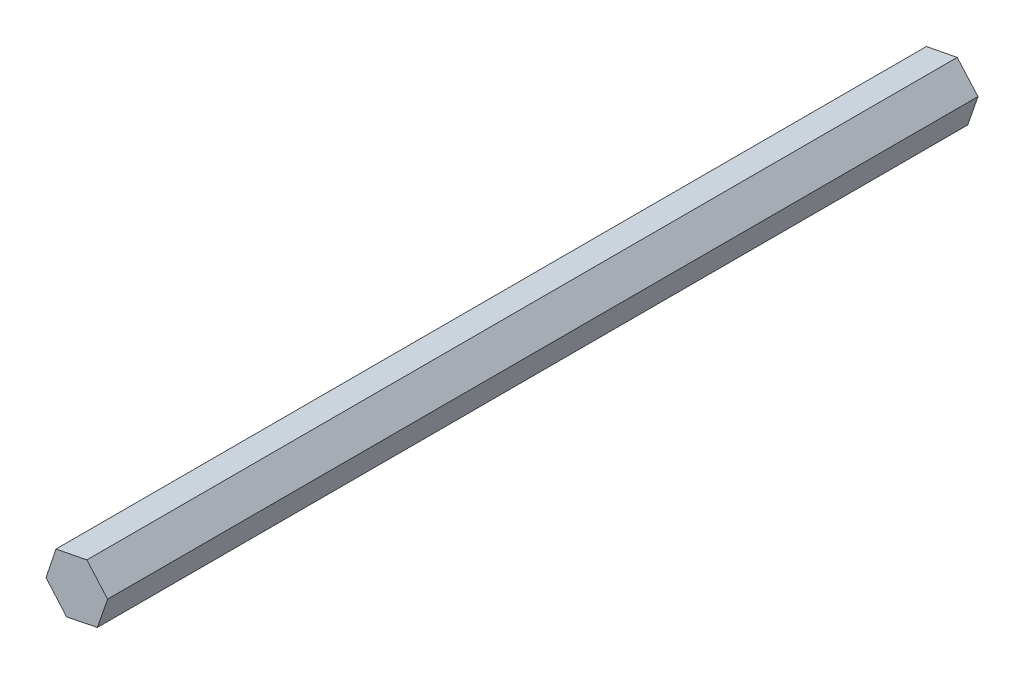
ISO-10303-21;
HEADER;
FILE_DESCRIPTION(('STEP AP214'),'2;1');
FILE_NAME('part.step','',(''),(''),'','','');
FILE_SCHEMA(('AUTOMOTIVE_DESIGN { 1 0 10303 214 1 1 1 1 }'));
ENDSEC;
DATA;
#1=APPLICATION_CONTEXT('core data for automotive mechanical design processes');
#2=APPLICATION_PROTOCOL_DEFINITION('international standard','automotive_design',2000,#1);
#3=PRODUCT_CONTEXT('',#1,'mechanical');
#4=PRODUCT('Part','Part','',(#3));
#5=PRODUCT_RELATED_PRODUCT_CATEGORY('part','',(#4));
#6=PRODUCT_DEFINITION_FORMATION('','',#4);
#7=PRODUCT_DEFINITION_CONTEXT('part definition',#1,'design');
#8=PRODUCT_DEFINITION('design','',#6,#7);
#9=PRODUCT_DEFINITION_SHAPE('','',#8);
#10=(LENGTH_UNIT() NAMED_UNIT(*) SI_UNIT(.MILLI.,.METRE.));
#11=(NAMED_UNIT(*) PLANE_ANGLE_UNIT() SI_UNIT($,.RADIAN.));
#12=(NAMED_UNIT(*) SI_UNIT($,.STERADIAN.) SOLID_ANGLE_UNIT());
#13=UNCERTAINTY_MEASURE_WITH_UNIT(LENGTH_MEASURE(1.E-05),#10,'distance_accuracy_value','');
#14=(GEOMETRIC_REPRESENTATION_CONTEXT(3) GLOBAL_UNCERTAINTY_ASSIGNED_CONTEXT((#13)) GLOBAL_UNIT_ASSIGNED_CONTEXT((#10,
#11,#12)) REPRESENTATION_CONTEXT('',''));
#15=CARTESIAN_POINT('',(0.,0.,0.));
#16=DIRECTION('',(0.,0.,1.));
#17=DIRECTION('',(1.,0.,0.));
#18=AXIS2_PLACEMENT_3D('',#15,#16,#17);
#19=CARTESIAN_POINT('',(-6.01957165055815,2.02169660033267,-25.4));
#20=DIRECTION('',(-0.947964039457976,0.318377417375223,0.));
#21=DIRECTION('',(-0.318377417375223,-0.947964039457976,0.));
#22=AXIS2_PLACEMENT_3D('',#19,#20,#21);
#23=PLANE('',#22);
#24=DIRECTION('',(0.318377417375223,0.947964039457976,0.));
#25=VECTOR('',#24,1.);
#26=CARTESIAN_POINT('',(-6.01957165055815,2.02169660033267,-228.6));
#27=LINE('',#26,#25);
#28=CARTESIAN_POINT('',(-7.17571857524597,-1.42071372502755,-228.6));
#29=VERTEX_POINT('',#28);
#30=CARTESIAN_POINT('',(-4.84121158124874,5.53024623443575,-228.6));
#31=VERTEX_POINT('',#30);
#32=EDGE_CURVE('E120',#29,#31,#27,.T.);
#33=ORIENTED_EDGE('',*,*,#32,.F.);
#34=DIRECTION('',(0.,0.,-1.));
#35=VECTOR('',#34,1.);
#36=CARTESIAN_POINT('',(-7.17571857524597,-1.42071372502755,-25.4));
#37=LINE('',#36,#35);
#38=CARTESIAN_POINT('',(-7.17571857524597,-1.42071372502755,-25.4));
#39=VERTEX_POINT('',#38);
#40=EDGE_CURVE('E11',#39,#29,#37,.T.);
#41=ORIENTED_EDGE('',*,*,#40,.F.);
#42=DIRECTION('',(0.318377417375223,0.947964039457976,0.));
#43=VECTOR('',#42,1.);
#44=CARTESIAN_POINT('',(-6.01957165055815,2.02169660033267,-25.4));
#45=LINE('',#44,#43);
#46=CARTESIAN_POINT('',(-4.84121158124874,5.53024623443575,-25.4));
#47=VERTEX_POINT('',#46);
#48=EDGE_CURVE('E134',#39,#47,#45,.T.);
#49=ORIENTED_EDGE('',*,*,#48,.T.);
#50=DIRECTION('',(0.,0.,-1.));
#51=VECTOR('',#50,1.);
#52=CARTESIAN_POINT('',(-4.84121158124874,5.53024623443575,-25.4));
#53=LINE('',#52,#51);
#54=EDGE_CURVE('E38',#47,#31,#53,.T.);
#55=ORIENTED_EDGE('',*,*,#54,.T.);
#56=EDGE_LOOP('',(#33,#41,#49,#55));
#57=FACE_BOUND('',#56,.T.);
#58=ADVANCED_FACE('F35',(#57),#23,.T.);
#59=CARTESIAN_POINT('',(-4.79509283412342,-4.16288177974564,-25.4));
#60=DIRECTION('',(-0.755132729783216,-0.655571933818211,0.));
#61=DIRECTION('',(0.655571933818211,-0.755132729783216,0.));
#62=AXIS2_PLACEMENT_3D('',#59,#60,#61);
#63=PLANE('',#62);
#64=DIRECTION('',(-0.655571933818211,0.755132729783216,0.));
#65=VECTOR('',#64,1.);
#66=CARTESIAN_POINT('',(-4.79509283412342,-4.16288177974564,-228.6));
#67=LINE('',#66,#65);
#68=CARTESIAN_POINT('',(-2.36872793758021,-6.95773533167472,-228.6));
#69=VERTEX_POINT('',#68);
#70=EDGE_CURVE('E132',#69,#29,#67,.T.);
#71=ORIENTED_EDGE('',*,*,#70,.F.);
#72=DIRECTION('',(0.,0.,-1.));
#73=VECTOR('',#72,1.);
#74=CARTESIAN_POINT('',(-2.36872793758021,-6.95773533167472,-25.4));
#75=LINE('',#74,#73);
#76=CARTESIAN_POINT('',(-2.36872793758021,-6.95773533167472,-25.4));
#77=VERTEX_POINT('',#76);
#78=EDGE_CURVE('E44',#77,#69,#75,.T.);
#79=ORIENTED_EDGE('',*,*,#78,.F.);
#80=DIRECTION('',(-0.655571933818211,0.755132729783216,0.));
#81=VECTOR('',#80,1.);
#82=CARTESIAN_POINT('',(-4.79509283412342,-4.16288177974564,-25.4));
#83=LINE('',#82,#81);
#84=EDGE_CURVE('E110',#77,#39,#83,.T.);
#85=ORIENTED_EDGE('',*,*,#84,.T.);
#86=ORIENTED_EDGE('',*,*,#40,.T.);
#87=EDGE_LOOP('',(#71,#79,#85,#86));
#88=FACE_BOUND('',#87,.T.);
#89=ADVANCED_FACE('F142',(#88),#63,.T.);
#90=CARTESIAN_POINT('',(1.25894521064635,-6.22395026945031,-25.4));
#91=DIRECTION('',(0.198259088290764,-0.980149648732333,0.));
#92=DIRECTION('',(0.980149648732333,0.198259088290764,0.));
#93=AXIS2_PLACEMENT_3D('',#90,#91,#92);
#94=PLANE('',#93);
#95=DIRECTION('',(-0.980149648732333,-0.198259088290764,0.));
#96=VECTOR('',#95,1.);
#97=CARTESIAN_POINT('',(1.25894521064635,-6.22395026945031,-228.6));
#98=LINE('',#97,#96);
#99=CARTESIAN_POINT('',(4.81823346500206,-5.50399771405711,-228.6));
#100=VERTEX_POINT('',#99);
#101=EDGE_CURVE('E97',#100,#69,#98,.T.);
#102=ORIENTED_EDGE('',*,*,#101,.F.);
#103=DIRECTION('',(0.,0.,-1.));
#104=VECTOR('',#103,1.);
#105=CARTESIAN_POINT('',(4.81823346500206,-5.50399771405711,-25.4));
#106=LINE('',#105,#104);
#107=CARTESIAN_POINT('',(4.81823346500206,-5.50399771405711,-25.4));
#108=VERTEX_POINT('',#107);
#109=EDGE_CURVE('E92',#108,#100,#106,.T.);
#110=ORIENTED_EDGE('',*,*,#109,.F.);
#111=DIRECTION('',(-0.980149648732333,-0.198259088290764,0.));
#112=VECTOR('',#111,1.);
#113=CARTESIAN_POINT('',(1.25894521064635,-6.22395026945031,-25.4));
#114=LINE('',#113,#112);
#115=EDGE_CURVE('E95',#108,#77,#114,.T.);
#116=ORIENTED_EDGE('',*,*,#115,.T.);
#117=ORIENTED_EDGE('',*,*,#78,.T.);
#118=EDGE_LOOP('',(#102,#110,#116,#117));
#119=FACE_BOUND('',#118,.T.);
#120=ADVANCED_FACE('F94',(#119),#94,.T.);
#121=CARTESIAN_POINT('',(6.00270779127281,-2.07123131798279,-25.4));
#122=DIRECTION('',(0.945308313586269,-0.32617816031225,0.));
#123=DIRECTION('',(0.32617816031225,0.945308313586269,0.));
#124=AXIS2_PLACEMENT_3D('',#121,#122,#123);
#125=PLANE('',#124);
#126=DIRECTION('',(-0.32617816031225,-0.945308313586269,0.));
#127=VECTOR('',#126,1.);
#128=CARTESIAN_POINT('',(6.00270779127281,-2.07123131798279,-228.6));
#129=LINE('',#128,#127);
#130=CARTESIAN_POINT('',(7.20993951882896,1.42748909723898,-228.6));
#131=VERTEX_POINT('',#130);
#132=EDGE_CURVE('E129',#131,#100,#129,.T.);
#133=ORIENTED_EDGE('',*,*,#132,.F.);
#134=DIRECTION('',(0.,0.,-1.));
#135=VECTOR('',#134,1.);
#136=CARTESIAN_POINT('',(7.20993951882896,1.42748909723898,-25.4));
#137=LINE('',#136,#135);
#138=CARTESIAN_POINT('',(7.20993951882896,1.42748909723898,-25.4));
#139=VERTEX_POINT('',#138);
#140=EDGE_CURVE('E102',#139,#131,#137,.T.);
#141=ORIENTED_EDGE('',*,*,#140,.F.);
#142=DIRECTION('',(-0.32617816031225,-0.945308313586269,0.));
#143=VECTOR('',#142,1.);
#144=CARTESIAN_POINT('',(6.00270779127281,-2.07123131798279,-25.4));
#145=LINE('',#144,#143);
#146=EDGE_CURVE('E108',#139,#108,#145,.T.);
#147=ORIENTED_EDGE('',*,*,#146,.T.);
#148=ORIENTED_EDGE('',*,*,#109,.T.);
#149=EDGE_LOOP('',(#133,#141,#147,#148));
#150=FACE_BOUND('',#149,.T.);
#151=ADVANCED_FACE('F112',(#150),#125,.T.);
#152=CARTESIAN_POINT('',(4.7606264399118,4.20225366911765,-25.4));
#153=DIRECTION('',(0.749704951167212,0.66177223135711,0.));
#154=DIRECTION('',(-0.66177223135711,0.749704951167212,0.));
#155=AXIS2_PLACEMENT_3D('',#152,#153,#154);
#156=PLANE('',#155);
#157=DIRECTION('',(0.66177223135711,-0.749704951167212,0.));
#158=VECTOR('',#157,1.);
#159=CARTESIAN_POINT('',(4.7606264399118,4.20225366911765,-228.6));
#160=LINE('',#159,#158);
#161=CARTESIAN_POINT('',(2.35748511024392,6.92471143908466,-228.6));
#162=VERTEX_POINT('',#161);
#163=EDGE_CURVE('E126',#162,#131,#160,.T.);
#164=ORIENTED_EDGE('',*,*,#163,.F.);
#165=DIRECTION('',(0.,0.,-1.));
#166=VECTOR('',#165,1.);
#167=CARTESIAN_POINT('',(2.35748511024392,6.92471143908466,-25.4));
#168=LINE('',#167,#166);
#169=CARTESIAN_POINT('',(2.35748511024392,6.92471143908466,-25.4));
#170=VERTEX_POINT('',#169);
#171=EDGE_CURVE('E137',#170,#162,#168,.T.);
#172=ORIENTED_EDGE('',*,*,#171,.F.);
#173=DIRECTION('',(0.66177223135711,-0.749704951167212,0.));
#174=VECTOR('',#173,1.);
#175=CARTESIAN_POINT('',(4.7606264399118,4.20225366911765,-25.4));
#176=LINE('',#175,#174);
#177=EDGE_CURVE('E113',#170,#139,#176,.T.);
#178=ORIENTED_EDGE('',*,*,#177,.T.);
#179=ORIENTED_EDGE('',*,*,#140,.T.);
#180=EDGE_LOOP('',(#164,#172,#178,#179));
#181=FACE_BOUND('',#180,.T.);
#182=ADVANCED_FACE('F155',(#181),#156,.T.);
#183=CARTESIAN_POINT('',(-1.20761495714939,6.23411309772842,-25.4));
#184=DIRECTION('',(-0.190175583803053,0.98175009413046,0.));
#185=DIRECTION('',(-0.981750094130461,-0.190175583803053,0.));
#186=AXIS2_PLACEMENT_3D('',#183,#184,#185);
#187=PLANE('',#186);
#188=DIRECTION('',(0.981750094130461,0.190175583803053,0.));
#189=VECTOR('',#188,1.);
#190=CARTESIAN_POINT('',(-1.20761495714939,6.23411309772842,-228.6));
#191=LINE('',#190,#189);
#192=EDGE_CURVE('E123',#31,#162,#191,.T.);
#193=ORIENTED_EDGE('',*,*,#192,.F.);
#194=ORIENTED_EDGE('',*,*,#54,.F.);
#195=DIRECTION('',(0.981750094130461,0.190175583803053,0.));
#196=VECTOR('',#195,1.);
#197=CARTESIAN_POINT('',(-1.20761495714939,6.23411309772842,-25.4));
#198=LINE('',#197,#196);
#199=EDGE_CURVE('E115',#47,#170,#198,.T.);
#200=ORIENTED_EDGE('',*,*,#199,.T.);
#201=ORIENTED_EDGE('',*,*,#171,.T.);
#202=EDGE_LOOP('',(#193,#194,#200,#201));
#203=FACE_BOUND('',#202,.T.);
#204=ADVANCED_FACE('F139',(#203),#187,.T.);
#205=CARTESIAN_POINT('',(0.,0.,-25.4));
#206=DIRECTION('',(0.,0.,-1.));
#207=DIRECTION('',(-1.,0.,0.));
#208=AXIS2_PLACEMENT_3D('',#205,#206,#207);
#209=PLANE('',#208);
#210=ORIENTED_EDGE('',*,*,#48,.F.);
#211=ORIENTED_EDGE('',*,*,#84,.F.);
#212=ORIENTED_EDGE('',*,*,#115,.F.);
#213=ORIENTED_EDGE('',*,*,#146,.F.);
#214=ORIENTED_EDGE('',*,*,#177,.F.);
#215=ORIENTED_EDGE('',*,*,#199,.F.);
#216=EDGE_LOOP('',(#210,#211,#212,#213,#214,#215));
#217=FACE_BOUND('',#216,.T.);
#218=ADVANCED_FACE('F106',(#217),#209,.F.);
#219=CARTESIAN_POINT('',(0.,0.,-228.6));
#220=DIRECTION('',(0.,0.,-1.));
#221=DIRECTION('',(-1.,0.,0.));
#222=AXIS2_PLACEMENT_3D('',#219,#220,#221);
#223=PLANE('',#222);
#224=ORIENTED_EDGE('',*,*,#32,.T.);
#225=ORIENTED_EDGE('',*,*,#192,.T.);
#226=ORIENTED_EDGE('',*,*,#163,.T.);
#227=ORIENTED_EDGE('',*,*,#132,.T.);
#228=ORIENTED_EDGE('',*,*,#101,.T.);
#229=ORIENTED_EDGE('',*,*,#70,.T.);
#230=EDGE_LOOP('',(#224,#225,#226,#227,#228,#229));
#231=FACE_BOUND('',#230,.T.);
#232=ADVANCED_FACE('F141',(#231),#223,.T.);
#233=CLOSED_SHELL('',(#58,#89,#120,#151,#182,#204,#218,#232));
#234=MANIFOLD_SOLID_BREP('B2',#233);
#235=ADVANCED_BREP_SHAPE_REPRESENTATION('',(#18,#234),#14);
#236=SHAPE_DEFINITION_REPRESENTATION(#9,#235);
ENDSEC;
END-ISO-10303-21;
